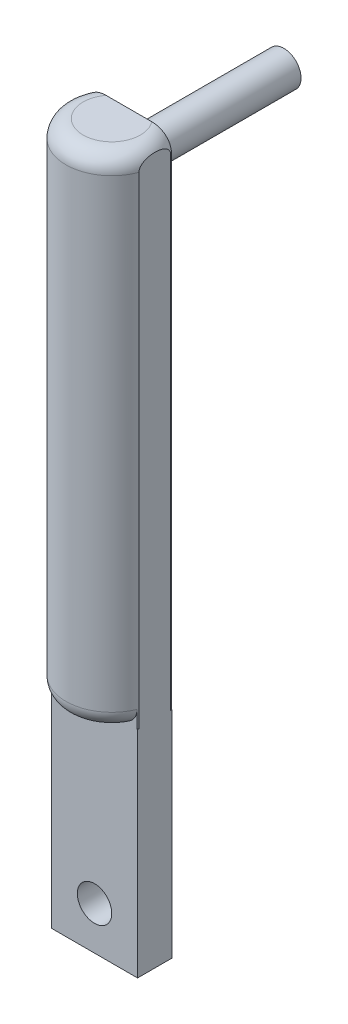
ISO-10303-21;
HEADER;
FILE_DESCRIPTION(('STEP AP214'),'2;1');
FILE_NAME('part.step','',(''),(''),'','','');
FILE_SCHEMA(('AUTOMOTIVE_DESIGN { 1 0 10303 214 1 1 1 1 }'));
ENDSEC;
DATA;
#1=APPLICATION_CONTEXT('core data for automotive mechanical design processes');
#2=APPLICATION_PROTOCOL_DEFINITION('international standard','automotive_design',2000,#1);
#3=PRODUCT_CONTEXT('',#1,'mechanical');
#4=PRODUCT('Part','Part','',(#3));
#5=PRODUCT_RELATED_PRODUCT_CATEGORY('part','',(#4));
#6=PRODUCT_DEFINITION_FORMATION('','',#4);
#7=PRODUCT_DEFINITION_CONTEXT('part definition',#1,'design');
#8=PRODUCT_DEFINITION('design','',#6,#7);
#9=PRODUCT_DEFINITION_SHAPE('','',#8);
#10=(LENGTH_UNIT() NAMED_UNIT(*) SI_UNIT(.MILLI.,.METRE.));
#11=(NAMED_UNIT(*) PLANE_ANGLE_UNIT() SI_UNIT($,.RADIAN.));
#12=(NAMED_UNIT(*) SI_UNIT($,.STERADIAN.) SOLID_ANGLE_UNIT());
#13=UNCERTAINTY_MEASURE_WITH_UNIT(LENGTH_MEASURE(1.E-05),#10,'distance_accuracy_value','');
#14=(GEOMETRIC_REPRESENTATION_CONTEXT(3) GLOBAL_UNCERTAINTY_ASSIGNED_CONTEXT((#13)) GLOBAL_UNIT_ASSIGNED_CONTEXT((#10,
#11,#12)) REPRESENTATION_CONTEXT('',''));
#15=CARTESIAN_POINT('',(0.,0.,0.));
#16=DIRECTION('',(0.,0.,1.));
#17=DIRECTION('',(1.,0.,0.));
#18=AXIS2_PLACEMENT_3D('',#15,#16,#17);
#19=CARTESIAN_POINT('',(-25.,37.5000000000001,20.));
#20=DIRECTION('',(0.,-1.,0.));
#21=DIRECTION('',(0.,0.,-1.));
#22=AXIS2_PLACEMENT_3D('',#19,#20,#21);
#23=PLANE('',#22);
#24=CARTESIAN_POINT('',(0.,37.5000000000001,10.));
#25=DIRECTION('',(0.,1.,0.));
#26=DIRECTION('',(0.,0.,1.));
#27=AXIS2_PLACEMENT_3D('',#24,#25,#26);
#28=CIRCLE('',#27,26.6340417534553);
#29=CARTESIAN_POINT('',(-25.,37.5000000000001,19.1854330395904));
#30=VERTEX_POINT('',#29);
#31=CARTESIAN_POINT('',(-24.6854649566258,37.5000000000001,20.));
#32=VERTEX_POINT('',#31);
#33=EDGE_CURVE('E167',#30,#32,#28,.T.);
#34=ORIENTED_EDGE('',*,*,#33,.F.);
#35=DIRECTION('',(0.,0.,-1.));
#36=VECTOR('',#35,1.);
#37=CARTESIAN_POINT('',(-25.,37.5000000000001,20.));
#38=LINE('',#37,#36);
#39=CARTESIAN_POINT('',(-25.,37.5000000000001,20.));
#40=VERTEX_POINT('',#39);
#41=EDGE_CURVE('E210',#40,#30,#38,.T.);
#42=ORIENTED_EDGE('',*,*,#41,.F.);
#43=DIRECTION('',(-1.,0.,0.));
#44=VECTOR('',#43,1.);
#45=CARTESIAN_POINT('',(-25.,37.5000000000001,20.));
#46=LINE('',#45,#44);
#47=EDGE_CURVE('E198',#32,#40,#46,.T.);
#48=ORIENTED_EDGE('',*,*,#47,.F.);
#49=EDGE_LOOP('',(#34,#42,#48));
#50=FACE_BOUND('',#49,.T.);
#51=ADVANCED_FACE('F34',(#50),#23,.F.);
#52=CARTESIAN_POINT('',(24.6854649566258,37.5000000000001,20.));
#53=VERTEX_POINT('',#52);
#54=CARTESIAN_POINT('',(25.,37.5000000000001,19.1854330395904));
#55=VERTEX_POINT('',#54);
#56=EDGE_CURVE('E174',#53,#55,#28,.T.);
#57=ORIENTED_EDGE('',*,*,#56,.F.);
#58=CARTESIAN_POINT('',(25.,37.5000000000001,20.));
#59=VERTEX_POINT('',#58);
#60=EDGE_CURVE('E199',#59,#53,#46,.T.);
#61=ORIENTED_EDGE('',*,*,#60,.F.);
#62=DIRECTION('',(0.,0.,-1.));
#63=VECTOR('',#62,1.);
#64=CARTESIAN_POINT('',(25.,37.5000000000001,20.));
#65=LINE('',#64,#63);
#66=EDGE_CURVE('E213',#59,#55,#65,.T.);
#67=ORIENTED_EDGE('',*,*,#66,.T.);
#68=EDGE_LOOP('',(#57,#61,#67));
#69=FACE_BOUND('',#68,.T.);
#70=ADVANCED_FACE('F328',(#69),#23,.F.);
#71=CARTESIAN_POINT('',(0.,37.5000000000001,10.));
#72=DIRECTION('',(0.,1.,0.));
#73=DIRECTION('',(0.,0.,1.));
#74=AXIS2_PLACEMENT_3D('',#71,#72,#73);
#75=CIRCLE('',#74,26.6340417534553);
#76=CARTESIAN_POINT('',(-24.6854649566258,37.5000000000001,0.));
#77=VERTEX_POINT('',#76);
#78=CARTESIAN_POINT('',(-25.,37.5000000000001,0.814566960409597));
#79=VERTEX_POINT('',#78);
#80=EDGE_CURVE('E166',#77,#79,#75,.T.);
#81=ORIENTED_EDGE('',*,*,#80,.F.);
#82=DIRECTION('',(-1.,0.,0.));
#83=VECTOR('',#82,1.);
#84=CARTESIAN_POINT('',(-25.,37.5000000000001,0.));
#85=LINE('',#84,#83);
#86=CARTESIAN_POINT('',(-25.,37.5000000000001,0.));
#87=VERTEX_POINT('',#86);
#88=EDGE_CURVE('E162',#77,#87,#85,.T.);
#89=ORIENTED_EDGE('',*,*,#88,.T.);
#90=EDGE_CURVE('E202',#79,#87,#38,.T.);
#91=ORIENTED_EDGE('',*,*,#90,.F.);
#92=EDGE_LOOP('',(#81,#89,#91));
#93=FACE_BOUND('',#92,.T.);
#94=ADVANCED_FACE('F258',(#93),#23,.F.);
#95=CARTESIAN_POINT('',(0.,0.,20.));
#96=DIRECTION('',(0.,0.,-1.));
#97=DIRECTION('',(-1.,0.,0.));
#98=AXIS2_PLACEMENT_3D('',#95,#96,#97);
#99=PLANE('',#98);
#100=DIRECTION('',(0.,-1.,0.));
#101=VECTOR('',#100,1.);
#102=CARTESIAN_POINT('',(-25.,-87.4999999999999,20.));
#103=LINE('',#102,#101);
#104=CARTESIAN_POINT('',(-25.,-87.4999999999999,20.));
#105=VERTEX_POINT('',#104);
#106=EDGE_CURVE('E161',#40,#105,#103,.T.);
#107=ORIENTED_EDGE('',*,*,#106,.T.);
#108=DIRECTION('',(1.,0.,0.));
#109=VECTOR('',#108,1.);
#110=CARTESIAN_POINT('',(-25.,-87.4999999999999,20.));
#111=LINE('',#110,#109);
#112=CARTESIAN_POINT('',(25.,-87.4999999999999,20.));
#113=VERTEX_POINT('',#112);
#114=EDGE_CURVE('E194',#105,#113,#111,.T.);
#115=ORIENTED_EDGE('',*,*,#114,.T.);
#116=DIRECTION('',(0.,1.,0.));
#117=VECTOR('',#116,1.);
#118=CARTESIAN_POINT('',(25.,-87.4999999999999,20.));
#119=LINE('',#118,#117);
#120=EDGE_CURVE('E196',#113,#59,#119,.T.);
#121=ORIENTED_EDGE('',*,*,#120,.T.);
#122=ORIENTED_EDGE('',*,*,#60,.T.);
#123=DIRECTION('',(0.,-1.,0.));
#124=VECTOR('',#123,1.);
#125=CARTESIAN_POINT('',(24.6854649566258,47.5000000000001,20.));
#126=LINE('',#125,#124);
#127=CARTESIAN_POINT('',(24.6854649566258,47.5000000000001,20.));
#128=VERTEX_POINT('',#127);
#129=EDGE_CURVE('E228',#128,#53,#126,.T.);
#130=ORIENTED_EDGE('',*,*,#129,.F.);
#131=CARTESIAN_POINT('',(24.6854649566258,47.5000000000001,20.));
#132=CARTESIAN_POINT('',(24.685502333544,47.2354048706731,20.));
#133=CARTESIAN_POINT('',(24.6741360931719,46.9708185569598,20.));
#134=CARTESIAN_POINT('',(24.6288688417906,46.4436173996782,20.));
#135=CARTESIAN_POINT('',(24.594971058111,46.1810022792113,20.));
#136=CARTESIAN_POINT('',(24.5050151062512,45.6602113688034,20.));
#137=CARTESIAN_POINT('',(24.4490073426315,45.4020268656095,20.));
#138=CARTESIAN_POINT('',(24.315351716817,44.8913238318034,20.));
#139=CARTESIAN_POINT('',(24.2377037496296,44.6388053286875,20.));
#140=CARTESIAN_POINT('',(24.0614658574471,44.1411991247243,20.));
#141=CARTESIAN_POINT('',(23.9628765841889,43.8961111928933,20.));
#142=CARTESIAN_POINT('',(23.7456242090275,43.4149980034634,20.));
#143=CARTESIAN_POINT('',(23.6269605105004,43.1789730154763,20.));
#144=CARTESIAN_POINT('',(23.3705575400671,42.7174563795879,20.));
#145=CARTESIAN_POINT('',(23.2328137271902,42.491967256304,20.));
#146=CARTESIAN_POINT('',(22.93943448027,42.0529531322834,20.));
#147=CARTESIAN_POINT('',(22.78379884132,41.8394282686093,20.));
#148=CARTESIAN_POINT('',(22.4524221709919,41.4211516686134,20.));
#149=CARTESIAN_POINT('',(22.2763240688215,41.2166829271807,20.));
#150=CARTESIAN_POINT('',(21.9082477159469,40.8225904806807,20.));
#151=CARTESIAN_POINT('',(21.7162692972657,40.6329669326824,20.));
#152=CARTESIAN_POINT('',(21.3180119435982,40.2695272458504,20.));
#153=CARTESIAN_POINT('',(21.1117373682874,40.0957063249914,20.));
#154=CARTESIAN_POINT('',(20.6863790104067,39.7645016280252,20.));
#155=CARTESIAN_POINT('',(20.4672940734397,39.6071193368457,20.));
#156=CARTESIAN_POINT('',(20.0034251911003,39.2997265635389,20.));
#157=CARTESIAN_POINT('',(19.7578947606835,39.1508425232746,20.));
#158=CARTESIAN_POINT('',(19.2559864632393,38.8726600926899,20.));
#159=CARTESIAN_POINT('',(18.9996079978619,38.7433627845299,20.));
#160=CARTESIAN_POINT('',(18.4774106008518,38.5042941110642,20.));
#161=CARTESIAN_POINT('',(18.211576860291,38.3945551534595,20.));
#162=CARTESIAN_POINT('',(17.6726102042045,38.1947596307076,20.));
#163=CARTESIAN_POINT('',(17.3994765765544,38.1047049937438,20.));
#164=CARTESIAN_POINT('',(16.8124858804315,37.9337631201385,20.));
#165=CARTESIAN_POINT('',(16.4978653875977,37.8554960767532,20.));
#166=CARTESIAN_POINT('',(15.8635570107187,37.7228356020987,20.));
#167=CARTESIAN_POINT('',(15.5438674321648,37.6684503361797,20.));
#168=CARTESIAN_POINT('',(14.9027615165873,37.5827496947825,20.));
#169=CARTESIAN_POINT('',(14.5813572580198,37.5513426122924,20.));
#170=CARTESIAN_POINT('',(13.9374432749619,37.5099575658924,20.));
#171=CARTESIAN_POINT('',(13.6149347858157,37.499960594515,20.));
#172=CARTESIAN_POINT('',(13.2925296710481,37.5000000000001,20.));
#173=B_SPLINE_CURVE_WITH_KNOTS('',3,(#131,#132,#133,#134,#135,#136,#137,#138,#139,#140,#141,
#142,#143,#144,#145,#146,#147,#148,#149,#150,#151,#152,#153,#154,#155,#156,#157,#158,#159,#160,
#161,#162,#163,#164,#165,#166,#167,#168,#169,#170,#171,#172),.UNSPECIFIED.,.F.,.F.,(4,2,2,2,2,2,
2,2,2,2,2,2,2,2,2,2,2,2,2,2,4),(0.,0.793528086377154,1.58694253540087,2.37855857135951,
3.17017844810043,3.96177369160078,4.75339246591003,5.54519996621658,6.33701653562515,
7.14566568868088,7.95432339646171,8.76273557648567,9.57122071863946,10.4317423579137,
11.292311523393,12.1542936354331,13.01636014539,13.9880016854706,14.9599751785634,
15.9280479972663,16.8952610234548),.UNSPECIFIED.);
#174=CARTESIAN_POINT('',(13.2925296710481,37.5000000000001,20.));
#175=VERTEX_POINT('',#174);
#176=EDGE_CURVE('E47',#128,#175,#173,.T.);
#177=ORIENTED_EDGE('',*,*,#176,.T.);
#178=CARTESIAN_POINT('',(-13.2925296710481,37.5000000000001,20.));
#179=VERTEX_POINT('',#178);
#180=EDGE_CURVE('E203',#175,#179,#46,.T.);
#181=ORIENTED_EDGE('',*,*,#180,.T.);
#182=CARTESIAN_POINT('',(-13.2925296710481,37.5000000000001,20.));
#183=CARTESIAN_POINT('',(-13.4678988208894,37.499998957693,20.));
#184=CARTESIAN_POINT('',(-13.6432588060788,37.5029466001775,20.));
#185=CARTESIAN_POINT('',(-13.9937855734076,37.514976364156,20.));
#186=CARTESIAN_POINT('',(-14.1689523329059,37.5240591409631,20.));
#187=CARTESIAN_POINT('',(-14.6941682591193,37.5608877316065,20.));
#188=CARTESIAN_POINT('',(-15.0436074790335,37.5982146960043,20.));
#189=CARTESIAN_POINT('',(-15.7401842543162,37.7002231729067,20.));
#190=CARTESIAN_POINT('',(-16.0873028901114,37.765034268809,20.));
#191=CARTESIAN_POINT('',(-16.7748721321702,37.923245288306,20.));
#192=CARTESIAN_POINT('',(-17.1153255857604,38.0166327076168,20.));
#193=CARTESIAN_POINT('',(-17.7468338880676,38.2199612468514,20.));
#194=CARTESIAN_POINT('',(-18.0389487657435,38.3266133990957,20.));
#195=CARTESIAN_POINT('',(-18.61366671236,38.5630132510472,20.));
#196=CARTESIAN_POINT('',(-18.8962711760362,38.6927575465046,20.));
#197=CARTESIAN_POINT('',(-19.4492108574748,38.9750647195608,20.));
#198=CARTESIAN_POINT('',(-19.7195677548349,39.1275850451958,20.));
#199=CARTESIAN_POINT('',(-20.2462128978425,39.4552725251177,20.));
#200=CARTESIAN_POINT('',(-20.502501350165,39.630439346585,20.));
#201=CARTESIAN_POINT('',(-21.0000191501439,40.0037882696041,20.));
#202=CARTESIAN_POINT('',(-21.2411556287769,40.2020943512131,20.));
#203=CARTESIAN_POINT('',(-21.704373805633,40.619880966814,20.));
#204=CARTESIAN_POINT('',(-21.926454855438,40.8393622208151,20.));
#205=CARTESIAN_POINT('',(-22.3492988941623,41.298193873444,20.));
#206=CARTESIAN_POINT('',(-22.5500517657368,41.5375536066573,20.));
#207=CARTESIAN_POINT('',(-22.9278708728071,42.0342767668804,20.));
#208=CARTESIAN_POINT('',(-23.1049399778125,42.2916380070748,20.));
#209=CARTESIAN_POINT('',(-23.4182572389001,42.7978674017579,20.));
#210=CARTESIAN_POINT('',(-23.5567615499112,43.0453417177048,20.));
#211=CARTESIAN_POINT('',(-23.8112062967775,43.5516225251864,20.));
#212=CARTESIAN_POINT('',(-23.9271485367665,43.8104281086085,20.));
#213=CARTESIAN_POINT('',(-24.1351791579827,44.3371000150378,20.));
#214=CARTESIAN_POINT('',(-24.2272964635335,44.6049549007166,20.));
#215=CARTESIAN_POINT('',(-24.3868869205741,45.1477878229566,20.));
#216=CARTESIAN_POINT('',(-24.4543691380709,45.4227631991146,20.));
#217=CARTESIAN_POINT('',(-24.567758903721,45.9966224895792,20.));
#218=CARTESIAN_POINT('',(-24.6118914497627,46.2958624980114,20.));
#219=CARTESIAN_POINT('',(-24.6560274209174,46.7465694439571,20.));
#220=CARTESIAN_POINT('',(-24.6670622560725,46.897033466352,20.));
#221=CARTESIAN_POINT('',(-24.6817811689466,47.1983230811585,20.));
#222=CARTESIAN_POINT('',(-24.6854651259334,47.3491486794679,20.));
#223=CARTESIAN_POINT('',(-24.6854649566258,47.5000000000001,20.));
#224=B_SPLINE_CURVE_WITH_KNOTS('',3,(#182,#183,#184,#185,#186,#187,#188,#189,#190,#191,#192,
#193,#194,#195,#196,#197,#198,#199,#200,#201,#202,#203,#204,#205,#206,#207,#208,#209,#210,#211,
#212,#213,#214,#215,#216,#217,#218,#219,#220,#221,#222,#223),.UNSPECIFIED.,.F.,.F.,(4,2,2,2,2,2,
2,2,2,2,2,2,2,2,2,2,2,2,2,2,4),(0.,0.526059487486561,1.05217517393821,2.10538108713694,
3.16360890057145,4.22137432056793,5.15335792112525,6.08520424204954,7.0153309054618,
7.94544390101876,8.88079150012673,9.8161709146338,10.7519920778019,11.6876997545846,
12.5373970816054,13.387026436221,14.2356194166075,15.0838997890608,15.9897497342592,
16.442200055629,16.8946578080581),.UNSPECIFIED.);
#225=CARTESIAN_POINT('',(-24.6854649566258,47.5000000000001,20.));
#226=VERTEX_POINT('',#225);
#227=EDGE_CURVE('E11',#179,#226,#224,.T.);
#228=ORIENTED_EDGE('',*,*,#227,.T.);
#229=DIRECTION('',(0.,-1.,0.));
#230=VECTOR('',#229,1.);
#231=CARTESIAN_POINT('',(-24.6854649566258,37.5000000000001,20.));
#232=LINE('',#231,#230);
#233=EDGE_CURVE('E53',#32,#226,#232,.F.);
#234=ORIENTED_EDGE('',*,*,#233,.F.);
#235=ORIENTED_EDGE('',*,*,#47,.T.);
#236=EDGE_LOOP('',(#107,#115,#121,#122,#130,#177,#181,#228,#234,#235));
#237=FACE_BOUND('',#236,.T.);
#238=CARTESIAN_POINT('',(0.,-62.5,20.));
#239=DIRECTION('',(0.,0.,1.));
#240=DIRECTION('',(1.,0.,0.));
#241=AXIS2_PLACEMENT_3D('',#238,#239,#240);
#242=CIRCLE('',#241,10.);
#243=CARTESIAN_POINT('',(10.,-62.5,20.));
#244=VERTEX_POINT('',#243);
#245=EDGE_CURVE('E186',#244,#244,#242,.T.);
#246=ORIENTED_EDGE('',*,*,#245,.F.);
#247=EDGE_LOOP('',(#246));
#248=FACE_BOUND('',#247,.T.);
#249=ADVANCED_FACE('F249',(#237,#248),#99,.F.);
#250=CARTESIAN_POINT('',(0.,0.,0.));
#251=DIRECTION('',(0.,0.,-1.));
#252=DIRECTION('',(-1.,0.,0.));
#253=AXIS2_PLACEMENT_3D('',#250,#251,#252);
#254=PLANE('',#253);
#255=CARTESIAN_POINT('',(0.,302.814535043374,0.));
#256=DIRECTION('',(0.,0.,-1.));
#257=DIRECTION('',(-1.,0.,0.));
#258=AXIS2_PLACEMENT_3D('',#255,#256,#257);
#259=CIRCLE('',#258,10.);
#260=CARTESIAN_POINT('',(9.99999999999998,302.814535043374,0.));
#261=VERTEX_POINT('',#260);
#262=EDGE_CURVE('E306',#261,#261,#259,.T.);
#263=ORIENTED_EDGE('',*,*,#262,.F.);
#264=EDGE_LOOP('',(#263));
#265=FACE_BOUND('',#264,.T.);
#266=DIRECTION('',(-1.,0.,0.));
#267=VECTOR('',#266,1.);
#268=CARTESIAN_POINT('',(0.,327.5,0.));
#269=LINE('',#268,#267);
#270=CARTESIAN_POINT('',(13.2925296710481,327.5,0.));
#271=VERTEX_POINT('',#270);
#272=CARTESIAN_POINT('',(-13.2925296710481,327.5,0.));
#273=VERTEX_POINT('',#272);
#274=EDGE_CURVE('E170',#271,#273,#269,.T.);
#275=ORIENTED_EDGE('',*,*,#274,.F.);
#276=CARTESIAN_POINT('',(13.2925296710481,327.5,0.));
#277=CARTESIAN_POINT('',(13.4678988208894,327.500001042307,0.));
#278=CARTESIAN_POINT('',(13.6432588060788,327.497053399823,0.));
#279=CARTESIAN_POINT('',(13.9937855734076,327.485023635844,0.));
#280=CARTESIAN_POINT('',(14.1689523329059,327.475940859037,0.));
#281=CARTESIAN_POINT('',(14.6941682591193,327.439112268394,0.));
#282=CARTESIAN_POINT('',(15.0436074790335,327.401785303996,0.));
#283=CARTESIAN_POINT('',(15.7401842543162,327.299776827093,0.));
#284=CARTESIAN_POINT('',(16.0873028901114,327.234965731191,0.));
#285=CARTESIAN_POINT('',(16.7748721321702,327.076754711694,0.));
#286=CARTESIAN_POINT('',(17.1153255857604,326.983367292383,0.));
#287=CARTESIAN_POINT('',(17.7468338880676,326.780038753149,0.));
#288=CARTESIAN_POINT('',(18.0389487657435,326.673386600904,0.));
#289=CARTESIAN_POINT('',(18.61366671236,326.436986748953,0.));
#290=CARTESIAN_POINT('',(18.8962711760362,326.307242453496,0.));
#291=CARTESIAN_POINT('',(19.4492108574748,326.024935280439,0.));
#292=CARTESIAN_POINT('',(19.7195677548349,325.872414954804,0.));
#293=CARTESIAN_POINT('',(20.2462128978425,325.544727474883,0.));
#294=CARTESIAN_POINT('',(20.502501350165,325.369560653415,0.));
#295=CARTESIAN_POINT('',(21.0000191501439,324.996211730396,0.));
#296=CARTESIAN_POINT('',(21.2411556287769,324.797905648787,0.));
#297=CARTESIAN_POINT('',(21.704373805633,324.380119033186,0.));
#298=CARTESIAN_POINT('',(21.9264548554379,324.160637779185,0.));
#299=CARTESIAN_POINT('',(22.3492988941623,323.701806126556,0.));
#300=CARTESIAN_POINT('',(22.5500517657369,323.462446393343,0.));
#301=CARTESIAN_POINT('',(22.9278708728071,322.96572323312,0.));
#302=CARTESIAN_POINT('',(23.1049399778125,322.708361992925,0.));
#303=CARTESIAN_POINT('',(23.4182572389001,322.202132598242,0.));
#304=CARTESIAN_POINT('',(23.5567615499112,321.954658282295,0.));
#305=CARTESIAN_POINT('',(23.8112062967775,321.448377474814,0.));
#306=CARTESIAN_POINT('',(23.9271485367665,321.189571891392,0.));
#307=CARTESIAN_POINT('',(24.1351791579827,320.662899984962,0.));
#308=CARTESIAN_POINT('',(24.2272964635336,320.395045099283,0.));
#309=CARTESIAN_POINT('',(24.3868869205741,319.852212177043,0.));
#310=CARTESIAN_POINT('',(24.4543691380709,319.577236800885,0.));
#311=CARTESIAN_POINT('',(24.567758903721,319.003377510421,0.));
#312=CARTESIAN_POINT('',(24.6118914497628,318.704137501989,0.));
#313=CARTESIAN_POINT('',(24.6560274209174,318.253430556043,0.));
#314=CARTESIAN_POINT('',(24.6670622560725,318.102966533648,0.));
#315=CARTESIAN_POINT('',(24.6817811689466,317.801676918842,0.));
#316=CARTESIAN_POINT('',(24.6854651259334,317.650851320532,0.));
#317=CARTESIAN_POINT('',(24.6854649566258,317.5,0.));
#318=B_SPLINE_CURVE_WITH_KNOTS('',3,(#276,#277,#278,#279,#280,#281,#282,#283,#284,#285,#286,
#287,#288,#289,#290,#291,#292,#293,#294,#295,#296,#297,#298,#299,#300,#301,#302,#303,#304,#305,
#306,#307,#308,#309,#310,#311,#312,#313,#314,#315,#316,#317),.UNSPECIFIED.,.F.,.F.,(4,2,2,2,2,2,
2,2,2,2,2,2,2,2,2,2,2,2,2,2,4),(0.,0.526059487486561,1.05217517393821,2.10538108713695,
3.16360890057146,4.22137432056793,5.15335792112522,6.08520424204955,7.0153309054618,
7.94544390101876,8.88079150012675,9.81617091463378,10.7519920778019,11.6876997545847,
12.5373970816054,13.387026436221,14.2356194166076,15.0838997890609,15.9897497342593,
16.4422000556289,16.8946578080581),.UNSPECIFIED.);
#319=CARTESIAN_POINT('',(24.6854649566258,317.5,0.));
#320=VERTEX_POINT('',#319);
#321=EDGE_CURVE('E147',#271,#320,#318,.T.);
#322=ORIENTED_EDGE('',*,*,#321,.T.);
#323=DIRECTION('',(0.,-1.,0.));
#324=VECTOR('',#323,1.);
#325=CARTESIAN_POINT('',(24.6854649566258,327.5,0.));
#326=LINE('',#325,#324);
#327=CARTESIAN_POINT('',(24.6854649566258,37.5000000000001,0.));
#328=VERTEX_POINT('',#327);
#329=EDGE_CURVE('E140',#320,#328,#326,.T.);
#330=ORIENTED_EDGE('',*,*,#329,.T.);
#331=CARTESIAN_POINT('',(25.,37.5000000000001,0.));
#332=VERTEX_POINT('',#331);
#333=EDGE_CURVE('E146',#332,#328,#85,.T.);
#334=ORIENTED_EDGE('',*,*,#333,.F.);
#335=DIRECTION('',(0.,1.,0.));
#336=VECTOR('',#335,1.);
#337=CARTESIAN_POINT('',(25.,-87.4999999999999,0.));
#338=LINE('',#337,#336);
#339=CARTESIAN_POINT('',(25.,-87.4999999999999,0.));
#340=VERTEX_POINT('',#339);
#341=EDGE_CURVE('E208',#340,#332,#338,.T.);
#342=ORIENTED_EDGE('',*,*,#341,.F.);
#343=DIRECTION('',(1.,0.,0.));
#344=VECTOR('',#343,1.);
#345=CARTESIAN_POINT('',(-25.,-87.4999999999999,0.));
#346=LINE('',#345,#344);
#347=CARTESIAN_POINT('',(-25.,-87.4999999999999,0.));
#348=VERTEX_POINT('',#347);
#349=EDGE_CURVE('E206',#348,#340,#346,.T.);
#350=ORIENTED_EDGE('',*,*,#349,.F.);
#351=DIRECTION('',(0.,-1.,0.));
#352=VECTOR('',#351,1.);
#353=CARTESIAN_POINT('',(-25.,-87.4999999999999,0.));
#354=LINE('',#353,#352);
#355=EDGE_CURVE('E189',#87,#348,#354,.T.);
#356=ORIENTED_EDGE('',*,*,#355,.F.);
#357=ORIENTED_EDGE('',*,*,#88,.F.);
#358=DIRECTION('',(0.,-1.,0.));
#359=VECTOR('',#358,1.);
#360=CARTESIAN_POINT('',(-24.6854649566258,327.5,0.));
#361=LINE('',#360,#359);
#362=CARTESIAN_POINT('',(-24.6854649566258,317.5,0.));
#363=VERTEX_POINT('',#362);
#364=EDGE_CURVE('E152',#363,#77,#361,.T.);
#365=ORIENTED_EDGE('',*,*,#364,.F.);
#366=CARTESIAN_POINT('',(-24.6854649566258,317.5,0.));
#367=CARTESIAN_POINT('',(-24.685502333544,317.764595129327,0.));
#368=CARTESIAN_POINT('',(-24.6741360931719,318.02918144304,0.));
#369=CARTESIAN_POINT('',(-24.6288688417906,318.556382600322,0.));
#370=CARTESIAN_POINT('',(-24.594971058111,318.818997720789,0.));
#371=CARTESIAN_POINT('',(-24.5050151062512,319.339788631197,0.));
#372=CARTESIAN_POINT('',(-24.4490073426316,319.597973134391,0.));
#373=CARTESIAN_POINT('',(-24.3153517168171,320.108676168197,0.));
#374=CARTESIAN_POINT('',(-24.2377037496296,320.361194671313,0.));
#375=CARTESIAN_POINT('',(-24.0614658574471,320.858800875276,0.));
#376=CARTESIAN_POINT('',(-23.9628765841889,321.103888807107,0.));
#377=CARTESIAN_POINT('',(-23.7456242090275,321.585001996537,0.));
#378=CARTESIAN_POINT('',(-23.6269605105004,321.821026984524,0.));
#379=CARTESIAN_POINT('',(-23.3705575400671,322.282543620412,0.));
#380=CARTESIAN_POINT('',(-23.2328137271902,322.508032743696,0.));
#381=CARTESIAN_POINT('',(-22.93943448027,322.947046867717,0.));
#382=CARTESIAN_POINT('',(-22.7837988413199,323.160571731391,0.));
#383=CARTESIAN_POINT('',(-22.4524221709919,323.578848331387,0.));
#384=CARTESIAN_POINT('',(-22.2763240688215,323.783317072819,0.));
#385=CARTESIAN_POINT('',(-21.9082477159469,324.177409519319,0.));
#386=CARTESIAN_POINT('',(-21.7162692972657,324.367033067318,0.));
#387=CARTESIAN_POINT('',(-21.3180119435981,324.73047275415,0.));
#388=CARTESIAN_POINT('',(-21.1117373682874,324.904293675009,0.));
#389=CARTESIAN_POINT('',(-20.6863790104067,325.235498371975,0.));
#390=CARTESIAN_POINT('',(-20.4672940734396,325.392880663154,0.));
#391=CARTESIAN_POINT('',(-20.0034251911002,325.700273436461,0.));
#392=CARTESIAN_POINT('',(-19.7578947606835,325.849157476726,0.));
#393=CARTESIAN_POINT('',(-19.2559864632393,326.12733990731,0.));
#394=CARTESIAN_POINT('',(-18.9996079978619,326.25663721547,0.));
#395=CARTESIAN_POINT('',(-18.4774106008518,326.495705888936,0.));
#396=CARTESIAN_POINT('',(-18.211576860291,326.605444846541,0.));
#397=CARTESIAN_POINT('',(-17.6726102042044,326.805240369293,0.));
#398=CARTESIAN_POINT('',(-17.3994765765544,326.895295006256,0.));
#399=CARTESIAN_POINT('',(-16.8124858804315,327.066236879862,0.));
#400=CARTESIAN_POINT('',(-16.4978653875977,327.144503923247,0.));
#401=CARTESIAN_POINT('',(-15.8635570107186,327.277164397901,0.));
#402=CARTESIAN_POINT('',(-15.5438674321648,327.33154966382,0.));
#403=CARTESIAN_POINT('',(-14.9027615165873,327.417250305218,0.));
#404=CARTESIAN_POINT('',(-14.5813572580198,327.448657387708,0.));
#405=CARTESIAN_POINT('',(-13.9374432749618,327.490042434108,0.));
#406=CARTESIAN_POINT('',(-13.6149347858157,327.500039405485,0.));
#407=CARTESIAN_POINT('',(-13.2925296710481,327.5,0.));
#408=B_SPLINE_CURVE_WITH_KNOTS('',3,(#366,#367,#368,#369,#370,#371,#372,#373,#374,#375,#376,
#377,#378,#379,#380,#381,#382,#383,#384,#385,#386,#387,#388,#389,#390,#391,#392,#393,#394,#395,
#396,#397,#398,#399,#400,#401,#402,#403,#404,#405,#406,#407),.UNSPECIFIED.,.F.,.F.,(4,2,2,2,2,2,
2,2,2,2,2,2,2,2,2,2,2,2,2,2,4),(0.,0.793528086377189,1.58694253540085,2.37855857135948,
3.17017844810043,3.9617736916008,4.75339246591005,5.54519996621661,6.33701653562517,
7.14566568868092,7.95432339646174,8.76273557648573,9.57122071863947,10.4317423579137,
11.2923115233931,12.1542936354332,13.01636014539,13.9880016854706,14.9599751785635,
15.9280479972663,16.8952610234548),.UNSPECIFIED.);
#409=EDGE_CURVE('E235',#363,#273,#408,.T.);
#410=ORIENTED_EDGE('',*,*,#409,.T.);
#411=EDGE_LOOP('',(#275,#322,#330,#334,#342,#350,#356,#357,#365,#410));
#412=FACE_BOUND('',#411,.T.);
#413=CARTESIAN_POINT('',(0.,-62.5,0.));
#414=DIRECTION('',(0.,0.,1.));
#415=DIRECTION('',(1.,0.,0.));
#416=AXIS2_PLACEMENT_3D('',#413,#414,#415);
#417=CIRCLE('',#416,10.);
#418=CARTESIAN_POINT('',(10.,-62.5,0.));
#419=VERTEX_POINT('',#418);
#420=EDGE_CURVE('E185',#419,#419,#417,.T.);
#421=ORIENTED_EDGE('',*,*,#420,.T.);
#422=EDGE_LOOP('',(#421));
#423=FACE_BOUND('',#422,.T.);
#424=ADVANCED_FACE('F143',(#265,#412,#423),#254,.T.);
#425=CARTESIAN_POINT('',(-25.,-87.4999999999999,20.));
#426=DIRECTION('',(1.,0.,0.));
#427=DIRECTION('',(0.,0.,-1.));
#428=AXIS2_PLACEMENT_3D('',#425,#426,#427);
#429=PLANE('',#428);
#430=DIRECTION('',(0.,-1.,0.));
#431=VECTOR('',#430,1.);
#432=CARTESIAN_POINT('',(-25.,327.5,19.1854330395904));
#433=LINE('',#432,#431);
#434=CARTESIAN_POINT('',(-25.,317.5,19.1854330395904));
#435=VERTEX_POINT('',#434);
#436=EDGE_CURVE('E177',#435,#30,#433,.T.);
#437=ORIENTED_EDGE('',*,*,#436,.F.);
#438=CARTESIAN_POINT('',(-25.,317.5,19.1854330395904));
#439=CARTESIAN_POINT('',(-25.,317.604031786222,19.1854666951989));
#440=CARTESIAN_POINT('',(-25.,317.708045694795,19.1807269973601));
#441=CARTESIAN_POINT('',(-25.,317.915160799453,19.1619591256552));
#442=CARTESIAN_POINT('',(-25.,318.018262587497,19.1479375048867));
#443=CARTESIAN_POINT('',(-25.,318.222022122098,19.1110089521886));
#444=CARTESIAN_POINT('',(-25.,318.322692704751,19.0881726755161));
#445=CARTESIAN_POINT('',(-25.,318.521729244324,19.0340794857688));
#446=CARTESIAN_POINT('',(-25.,318.620094895677,19.0028214630056));
#447=CARTESIAN_POINT('',(-25.,318.910312477992,18.8974050116726));
#448=CARTESIAN_POINT('',(-25.,319.097993151133,18.8114702638095));
#449=CARTESIAN_POINT('',(-25.,319.45901691984,18.6132641309951));
#450=CARTESIAN_POINT('',(-25.,319.632329186126,18.5009380023748));
#451=CARTESIAN_POINT('',(-25.,320.051047829676,18.1898074073288));
#452=CARTESIAN_POINT('',(-25.,320.285874538765,17.9767528728676));
#453=CARTESIAN_POINT('',(-25.,320.718990415879,17.5162874675845));
#454=CARTESIAN_POINT('',(-25.,320.917191615364,17.268796319735));
#455=CARTESIAN_POINT('',(-25.,321.239750573895,16.8079557822696));
#456=CARTESIAN_POINT('',(-25.,321.370746140719,16.5991555953374));
#457=CARTESIAN_POINT('',(-25.,321.614129114558,16.170885300247));
#458=CARTESIAN_POINT('',(-25.,321.726505963097,15.9514092285417));
#459=CARTESIAN_POINT('',(-25.,321.934329482543,15.5043550250329));
#460=CARTESIAN_POINT('',(-25.,322.029757117567,15.2767681238606));
#461=CARTESIAN_POINT('',(-25.,322.205026089465,14.8156412196847));
#462=CARTESIAN_POINT('',(-25.,322.284862201348,14.5820992505748));
#463=CARTESIAN_POINT('',(-25.,322.474963204576,13.9653772183932));
#464=CARTESIAN_POINT('',(-25.,322.573688218849,13.5786180823795));
#465=CARTESIAN_POINT('',(-25.,322.737806311967,12.79802636433));
#466=CARTESIAN_POINT('',(-25.,322.803178377431,12.4041894844346));
#467=CARTESIAN_POINT('',(-25.,322.903344989268,11.6114200595047));
#468=CARTESIAN_POINT('',(-25.,322.938042223146,11.2124753419432));
#469=CARTESIAN_POINT('',(-25.,322.977912461758,10.4132462567807));
#470=CARTESIAN_POINT('',(-25.,322.983092930764,10.0129622534832));
#471=CARTESIAN_POINT('',(-25.,322.963733056265,9.19475034351269));
#472=CARTESIAN_POINT('',(-25.,322.937821137966,8.77685367966653));
#473=CARTESIAN_POINT('',(-25.,322.852796463242,7.94419671650391));
#474=CARTESIAN_POINT('',(-25.,322.793668282995,7.52943796500411));
#475=CARTESIAN_POINT('',(-25.,322.639954385971,6.70870966049234));
#476=CARTESIAN_POINT('',(-25.,322.545557487054,6.30270526898522));
#477=CARTESIAN_POINT('',(-25.,322.317144240064,5.50223988840985));
#478=CARTESIAN_POINT('',(-25.,322.183176280506,5.10776544391717));
#479=CARTESIAN_POINT('',(-25.,321.893048136071,4.39474034420363));
#480=CARTESIAN_POINT('',(-25.,321.743185942826,4.07364627353047));
#481=CARTESIAN_POINT('',(-25.,321.405314412571,3.45096491353142));
#482=CARTESIAN_POINT('',(-25.,321.217252605881,3.14940521560024));
#483=CARTESIAN_POINT('',(-25.,320.901564464622,2.71863015789844));
#484=CARTESIAN_POINT('',(-25.,320.789813439379,2.57770459607868));
#485=CARTESIAN_POINT('',(-25.,320.554605236225,2.30583330491185));
#486=CARTESIAN_POINT('',(-25.,320.431145559463,2.17488971671318));
#487=CARTESIAN_POINT('',(-25.,320.172557933681,1.92585251125206));
#488=CARTESIAN_POINT('',(-25.,320.037468549575,1.80771915137536));
#489=CARTESIAN_POINT('',(-25.,319.755381373469,1.58681090852511));
#490=CARTESIAN_POINT('',(-25.,319.608394248671,1.4840224978201));
#491=CARTESIAN_POINT('',(-25.,319.275233227431,1.27999577212326));
#492=CARTESIAN_POINT('',(-25.,319.086783301297,1.18240915123292));
#493=CARTESIAN_POINT('',(-25.,318.696793711093,1.01902804001837));
#494=CARTESIAN_POINT('',(-25.,318.495284984441,0.95316131662604));
#495=CARTESIAN_POINT('',(-25.,318.160422415097,0.875559752598468));
#496=CARTESIAN_POINT('',(-25.,318.029560262482,0.852805296775282));
#497=CARTESIAN_POINT('',(-25.,317.76583470863,0.822258292602205));
#498=CARTESIAN_POINT('',(-25.,317.632967727357,0.814496794148942));
#499=CARTESIAN_POINT('',(-25.,317.5,0.814566960409589));
#500=B_SPLINE_CURVE_WITH_KNOTS('',3,(#438,#439,#440,#441,#442,#443,#444,#445,#446,#447,#448,
#449,#450,#451,#452,#453,#454,#455,#456,#457,#458,#459,#460,#461,#462,#463,#464,#465,#466,#467,
#468,#469,#470,#471,#472,#473,#474,#475,#476,#477,#478,#479,#480,#481,#482,#483,#484,#485,#486,
#487,#488,#489,#490,#491,#492,#493,#494,#495,#496,#497,#498,#499),.UNSPECIFIED.,.F.,.F.,(4,2,2,
2,2,2,2,2,2,2,2,2,2,2,2,2,2,2,2,2,2,2,2,2,2,2,2,2,2,2,4),(0.,0.311958284907773,
0.623696559813341,0.932986267869852,1.24231674932355,1.85884209791757,2.47665777561955,
3.4225023503741,4.37058997276709,5.10906437818921,5.84795614167855,6.58767258773035,
7.32763650189633,8.52330611545624,9.7197281101409,10.9199321400584,12.1198326459383,
13.3746685201942,14.6300875540339,15.8788795873954,17.1261508431916,18.1872349658631,
19.2497865347362,19.7888253769274,20.3279795203027,20.865410005539,21.402363871314,
22.0365572945888,22.6692996118125,23.0669738396402,23.4654707578147),.UNSPECIFIED.);
#501=CARTESIAN_POINT('',(-25.,317.5,0.814566960409597));
#502=VERTEX_POINT('',#501);
#503=EDGE_CURVE('E61',#435,#502,#500,.T.);
#504=ORIENTED_EDGE('',*,*,#503,.T.);
#505=DIRECTION('',(0.,-1.,0.));
#506=VECTOR('',#505,1.);
#507=CARTESIAN_POINT('',(-25.,327.5,0.814566960409597));
#508=LINE('',#507,#506);
#509=EDGE_CURVE('E179',#502,#79,#508,.T.);
#510=ORIENTED_EDGE('',*,*,#509,.T.);
#511=ORIENTED_EDGE('',*,*,#90,.T.);
#512=ORIENTED_EDGE('',*,*,#355,.T.);
#513=DIRECTION('',(0.,0.,-1.));
#514=VECTOR('',#513,1.);
#515=CARTESIAN_POINT('',(-25.,-87.4999999999999,20.));
#516=LINE('',#515,#514);
#517=EDGE_CURVE('E219',#105,#348,#516,.T.);
#518=ORIENTED_EDGE('',*,*,#517,.F.);
#519=ORIENTED_EDGE('',*,*,#106,.F.);
#520=ORIENTED_EDGE('',*,*,#41,.T.);
#521=EDGE_LOOP('',(#437,#504,#510,#511,#512,#518,#519,#520));
#522=FACE_BOUND('',#521,.T.);
#523=ADVANCED_FACE('F248',(#522),#429,.F.);
#524=CARTESIAN_POINT('',(-25.,-87.4999999999999,20.));
#525=DIRECTION('',(0.,1.,0.));
#526=DIRECTION('',(0.,0.,1.));
#527=AXIS2_PLACEMENT_3D('',#524,#525,#526);
#528=PLANE('',#527);
#529=ORIENTED_EDGE('',*,*,#349,.T.);
#530=DIRECTION('',(0.,0.,-1.));
#531=VECTOR('',#530,1.);
#532=CARTESIAN_POINT('',(25.,-87.4999999999999,20.));
#533=LINE('',#532,#531);
#534=EDGE_CURVE('E216',#113,#340,#533,.T.);
#535=ORIENTED_EDGE('',*,*,#534,.F.);
#536=ORIENTED_EDGE('',*,*,#114,.F.);
#537=ORIENTED_EDGE('',*,*,#517,.T.);
#538=EDGE_LOOP('',(#529,#535,#536,#537));
#539=FACE_BOUND('',#538,.T.);
#540=ADVANCED_FACE('F262',(#539),#528,.F.);
#541=CARTESIAN_POINT('',(25.,-87.4999999999999,20.));
#542=DIRECTION('',(-1.,0.,0.));
#543=DIRECTION('',(0.,0.,1.));
#544=AXIS2_PLACEMENT_3D('',#541,#542,#543);
#545=PLANE('',#544);
#546=DIRECTION('',(0.,-1.,0.));
#547=VECTOR('',#546,1.);
#548=CARTESIAN_POINT('',(25.,327.5,0.814566960409597));
#549=LINE('',#548,#547);
#550=CARTESIAN_POINT('',(25.,317.5,0.814566960409597));
#551=VERTEX_POINT('',#550);
#552=CARTESIAN_POINT('',(25.,37.5000000000001,0.814566960409597));
#553=VERTEX_POINT('',#552);
#554=EDGE_CURVE('E151',#551,#553,#549,.T.);
#555=ORIENTED_EDGE('',*,*,#554,.F.);
#556=CARTESIAN_POINT('',(25.,317.5,0.814566960409597));
#557=CARTESIAN_POINT('',(25.,317.604031786222,0.814533304801102));
#558=CARTESIAN_POINT('',(25.,317.708045694795,0.819273002639939));
#559=CARTESIAN_POINT('',(25.,317.915160799453,0.838040874344783));
#560=CARTESIAN_POINT('',(25.,318.018262587497,0.852062495113288));
#561=CARTESIAN_POINT('',(25.,318.222022122098,0.88899104781143));
#562=CARTESIAN_POINT('',(25.,318.322692704751,0.911827324483936));
#563=CARTESIAN_POINT('',(25.,318.521729244324,0.965920514231206));
#564=CARTESIAN_POINT('',(25.,318.620094895677,0.997178536994381));
#565=CARTESIAN_POINT('',(25.,318.910312477992,1.10259498832743));
#566=CARTESIAN_POINT('',(25.,319.097993151133,1.18852973619047));
#567=CARTESIAN_POINT('',(25.,319.45901691984,1.38673586900494));
#568=CARTESIAN_POINT('',(25.,319.632329186126,1.4990619976252));
#569=CARTESIAN_POINT('',(25.,320.051047829676,1.81019259267114));
#570=CARTESIAN_POINT('',(25.,320.285874538765,2.02324712713238));
#571=CARTESIAN_POINT('',(25.,320.718990415879,2.48371253241553));
#572=CARTESIAN_POINT('',(25.,320.917191615364,2.73120368026502));
#573=CARTESIAN_POINT('',(25.,321.239750573895,3.19204421773043));
#574=CARTESIAN_POINT('',(25.,321.370746140719,3.40084440466263));
#575=CARTESIAN_POINT('',(25.,321.614129114558,3.82911469975301));
#576=CARTESIAN_POINT('',(25.,321.726505963097,4.04859077145833));
#577=CARTESIAN_POINT('',(25.,321.934329482543,4.49564497496713));
#578=CARTESIAN_POINT('',(25.,322.029757117567,4.7232318761394));
#579=CARTESIAN_POINT('',(25.,322.205026089465,5.18435878031526));
#580=CARTESIAN_POINT('',(25.,322.284862201348,5.41790074942516));
#581=CARTESIAN_POINT('',(25.,322.474963204576,6.03462278160678));
#582=CARTESIAN_POINT('',(25.,322.573688218849,6.42138191762047));
#583=CARTESIAN_POINT('',(25.,322.737806311967,7.20197363566994));
#584=CARTESIAN_POINT('',(25.,322.803178377431,7.59581051556536));
#585=CARTESIAN_POINT('',(25.,322.903344989268,8.38857994049527));
#586=CARTESIAN_POINT('',(25.,322.938042223146,8.78752465805676));
#587=CARTESIAN_POINT('',(25.,322.977912461758,9.58675374321933));
#588=CARTESIAN_POINT('',(25.,322.983092930764,9.98703774651677));
#589=CARTESIAN_POINT('',(25.,322.963733056265,10.8052496564873));
#590=CARTESIAN_POINT('',(25.,322.937821137966,11.2231463203335));
#591=CARTESIAN_POINT('',(25.,322.852796463242,12.0558032834961));
#592=CARTESIAN_POINT('',(25.,322.793668282995,12.4705620349959));
#593=CARTESIAN_POINT('',(25.,322.639954385971,13.2912903395076));
#594=CARTESIAN_POINT('',(25.,322.545557487054,13.6972947310148));
#595=CARTESIAN_POINT('',(25.,322.317144240064,14.4977601115901));
#596=CARTESIAN_POINT('',(25.,322.183176280506,14.8922345560828));
#597=CARTESIAN_POINT('',(25.,321.893048136071,15.6052596557964));
#598=CARTESIAN_POINT('',(25.,321.743185942826,15.9263537264695));
#599=CARTESIAN_POINT('',(25.,321.405314412571,16.5490350864686));
#600=CARTESIAN_POINT('',(25.,321.217252605881,16.8505947843997));
#601=CARTESIAN_POINT('',(25.,320.901564464622,17.2813698421016));
#602=CARTESIAN_POINT('',(25.,320.789813439379,17.4222954039213));
#603=CARTESIAN_POINT('',(25.,320.554605236225,17.6941666950882));
#604=CARTESIAN_POINT('',(25.,320.431145559463,17.8251102832868));
#605=CARTESIAN_POINT('',(25.,320.17255793368,18.0741474887479));
#606=CARTESIAN_POINT('',(25.,320.037468549575,18.1922808486246));
#607=CARTESIAN_POINT('',(25.,319.755381373469,18.4131890914749));
#608=CARTESIAN_POINT('',(25.,319.608394248671,18.5159775021799));
#609=CARTESIAN_POINT('',(25.,319.275233227431,18.7200042278768));
#610=CARTESIAN_POINT('',(25.,319.086783301297,18.8175908487671));
#611=CARTESIAN_POINT('',(25.,318.696793711093,18.9809719599816));
#612=CARTESIAN_POINT('',(25.,318.495284984441,19.046838683374));
#613=CARTESIAN_POINT('',(25.,318.160422415097,19.1244402474015));
#614=CARTESIAN_POINT('',(25.,318.029560262482,19.1471947032247));
#615=CARTESIAN_POINT('',(25.,317.76583470863,19.1777417073978));
#616=CARTESIAN_POINT('',(25.,317.632967727357,19.1855032058511));
#617=CARTESIAN_POINT('',(25.,317.5,19.1854330395904));
#618=B_SPLINE_CURVE_WITH_KNOTS('',3,(#556,#557,#558,#559,#560,#561,#562,#563,#564,#565,#566,
#567,#568,#569,#570,#571,#572,#573,#574,#575,#576,#577,#578,#579,#580,#581,#582,#583,#584,#585,
#586,#587,#588,#589,#590,#591,#592,#593,#594,#595,#596,#597,#598,#599,#600,#601,#602,#603,#604,
#605,#606,#607,#608,#609,#610,#611,#612,#613,#614,#615,#616,#617),.UNSPECIFIED.,.F.,.F.,(4,2,2,
2,2,2,2,2,2,2,2,2,2,2,2,2,2,2,2,2,2,2,2,2,2,2,2,2,2,2,4),(0.,0.311958284907773,
0.623696559813341,0.93298626786985,1.24231674932354,1.85884209791757,2.47665777561955,
3.42250235037409,4.37058997276708,5.1090643781892,5.84795614167855,6.58767258773035,
7.32763650189632,8.52330611545624,9.71972811014089,10.9199321400583,12.1198326459383,
13.3746685201942,14.6300875540339,15.8788795873954,17.1261508431916,18.187234965863,
19.2497865347362,19.7888253769274,20.3279795203027,20.8654100055391,21.402363871314,
22.0365572945889,22.6692996118125,23.0669738396402,23.4654707578147),.UNSPECIFIED.);
#619=CARTESIAN_POINT('',(25.,317.5,19.1854330395904));
#620=VERTEX_POINT('',#619);
#621=EDGE_CURVE('E266',#551,#620,#618,.T.);
#622=ORIENTED_EDGE('',*,*,#621,.T.);
#623=DIRECTION('',(0.,-1.,0.));
#624=VECTOR('',#623,1.);
#625=CARTESIAN_POINT('',(25.,327.5,19.1854330395904));
#626=LINE('',#625,#624);
#627=EDGE_CURVE('E183',#620,#55,#626,.T.);
#628=ORIENTED_EDGE('',*,*,#627,.T.);
#629=ORIENTED_EDGE('',*,*,#66,.F.);
#630=ORIENTED_EDGE('',*,*,#120,.F.);
#631=ORIENTED_EDGE('',*,*,#534,.T.);
#632=ORIENTED_EDGE('',*,*,#341,.T.);
#633=EDGE_CURVE('E159',#553,#332,#65,.T.);
#634=ORIENTED_EDGE('',*,*,#633,.F.);
#635=EDGE_LOOP('',(#555,#622,#628,#629,#630,#631,#632,#634));
#636=FACE_BOUND('',#635,.T.);
#637=ADVANCED_FACE('F257',(#636),#545,.F.);
#638=CARTESIAN_POINT('',(0.,37.5000000000001,10.));
#639=DIRECTION('',(0.,1.,0.));
#640=DIRECTION('',(0.,0.,1.));
#641=AXIS2_PLACEMENT_3D('',#638,#639,#640);
#642=CIRCLE('',#641,26.6340417534553);
#643=EDGE_CURVE('E157',#553,#328,#642,.T.);
#644=ORIENTED_EDGE('',*,*,#643,.F.);
#645=ORIENTED_EDGE('',*,*,#633,.T.);
#646=ORIENTED_EDGE('',*,*,#333,.T.);
#647=EDGE_LOOP('',(#644,#645,#646));
#648=FACE_BOUND('',#647,.T.);
#649=ADVANCED_FACE('F156',(#648),#23,.F.);
#650=CARTESIAN_POINT('',(0.,-62.5,20.));
#651=DIRECTION('',(0.,0.,-1.));
#652=DIRECTION('',(-1.,0.,0.));
#653=AXIS2_PLACEMENT_3D('',#650,#651,#652);
#654=CYLINDRICAL_SURFACE('',#653,10.);
#655=ORIENTED_EDGE('',*,*,#245,.T.);
#656=EDGE_LOOP('',(#655));
#657=FACE_BOUND('',#656,.T.);
#658=ORIENTED_EDGE('',*,*,#420,.F.);
#659=EDGE_LOOP('',(#658));
#660=FACE_BOUND('',#659,.T.);
#661=ADVANCED_FACE('F256',(#657,#660),#654,.F.);
#662=CARTESIAN_POINT('',(0.,327.5,10.));
#663=DIRECTION('',(0.,-1.,0.));
#664=DIRECTION('',(0.,0.,-1.));
#665=AXIS2_PLACEMENT_3D('',#662,#663,#664);
#666=CYLINDRICAL_SURFACE('',#665,26.6340417534553);
#667=CARTESIAN_POINT('',(0.,47.5000000000001,10.));
#668=DIRECTION('',(0.,1.,0.));
#669=DIRECTION('',(0.,0.,1.));
#670=AXIS2_PLACEMENT_3D('',#667,#668,#669);
#671=CIRCLE('',#670,26.6340417534553);
#672=EDGE_CURVE('E225',#226,#128,#671,.T.);
#673=ORIENTED_EDGE('',*,*,#672,.T.);
#674=ORIENTED_EDGE('',*,*,#129,.T.);
#675=ORIENTED_EDGE('',*,*,#56,.T.);
#676=ORIENTED_EDGE('',*,*,#627,.F.);
#677=CARTESIAN_POINT('',(0.,317.5,10.));
#678=DIRECTION('',(0.,1.,0.));
#679=DIRECTION('',(0.,0.,1.));
#680=AXIS2_PLACEMENT_3D('',#677,#678,#679);
#681=CIRCLE('',#680,26.6340417534553);
#682=EDGE_CURVE('E222',#620,#435,#681,.F.);
#683=ORIENTED_EDGE('',*,*,#682,.T.);
#684=ORIENTED_EDGE('',*,*,#436,.T.);
#685=ORIENTED_EDGE('',*,*,#33,.T.);
#686=ORIENTED_EDGE('',*,*,#233,.T.);
#687=EDGE_LOOP('',(#673,#674,#675,#676,#683,#684,#685,#686));
#688=FACE_BOUND('',#687,.T.);
#689=ADVANCED_FACE('F345',(#688),#666,.T.);
#690=CARTESIAN_POINT('',(0.,327.5,10.));
#691=DIRECTION('',(0.,-1.,0.));
#692=DIRECTION('',(0.,0.,-1.));
#693=AXIS2_PLACEMENT_3D('',#690,#691,#692);
#694=CYLINDRICAL_SURFACE('',#693,26.6340417534553);
#695=ORIENTED_EDGE('',*,*,#329,.F.);
#696=CARTESIAN_POINT('',(0.,317.5,10.));
#697=DIRECTION('',(0.,-1.,0.));
#698=DIRECTION('',(0.,0.,-1.));
#699=AXIS2_PLACEMENT_3D('',#696,#697,#698);
#700=CIRCLE('',#699,26.6340417534553);
#701=EDGE_CURVE('E271',#320,#551,#700,.T.);
#702=ORIENTED_EDGE('',*,*,#701,.T.);
#703=ORIENTED_EDGE('',*,*,#554,.T.);
#704=ORIENTED_EDGE('',*,*,#643,.T.);
#705=EDGE_LOOP('',(#695,#702,#703,#704));
#706=FACE_BOUND('',#705,.T.);
#707=ADVANCED_FACE('F164',(#706),#694,.T.);
#708=CARTESIAN_POINT('',(0.,327.5,10.));
#709=DIRECTION('',(0.,-1.,0.));
#710=DIRECTION('',(0.,0.,-1.));
#711=AXIS2_PLACEMENT_3D('',#708,#709,#710);
#712=CYLINDRICAL_SURFACE('',#711,26.6340417534553);
#713=ORIENTED_EDGE('',*,*,#509,.F.);
#714=CARTESIAN_POINT('',(0.,317.5,10.));
#715=DIRECTION('',(0.,-1.,0.));
#716=DIRECTION('',(0.,0.,-1.));
#717=AXIS2_PLACEMENT_3D('',#714,#715,#716);
#718=CIRCLE('',#717,26.6340417534553);
#719=EDGE_CURVE('E276',#502,#363,#718,.T.);
#720=ORIENTED_EDGE('',*,*,#719,.T.);
#721=ORIENTED_EDGE('',*,*,#364,.T.);
#722=ORIENTED_EDGE('',*,*,#80,.T.);
#723=EDGE_LOOP('',(#713,#720,#721,#722));
#724=FACE_BOUND('',#723,.T.);
#725=ADVANCED_FACE('F294',(#724),#712,.T.);
#726=CARTESIAN_POINT('',(0.,327.5,0.));
#727=DIRECTION('',(0.,1.,0.));
#728=DIRECTION('',(0.,0.,1.));
#729=AXIS2_PLACEMENT_3D('',#726,#727,#728);
#730=PLANE('',#729);
#731=ORIENTED_EDGE('',*,*,#274,.T.);
#732=CARTESIAN_POINT('',(0.,327.5,10.));
#733=DIRECTION('',(0.,1.,0.));
#734=DIRECTION('',(0.,0.,1.));
#735=AXIS2_PLACEMENT_3D('',#732,#733,#734);
#736=CIRCLE('',#735,16.6340417534553);
#737=EDGE_CURVE('E232',#273,#271,#736,.T.);
#738=ORIENTED_EDGE('',*,*,#737,.T.);
#739=EDGE_LOOP('',(#731,#738));
#740=FACE_BOUND('',#739,.T.);
#741=ADVANCED_FACE('F304',(#740),#730,.T.);
#742=CARTESIAN_POINT('',(0.,37.5000000000001,0.));
#743=DIRECTION('',(0.,1.,0.));
#744=DIRECTION('',(0.,0.,1.));
#745=AXIS2_PLACEMENT_3D('',#742,#743,#744);
#746=PLANE('',#745);
#747=ORIENTED_EDGE('',*,*,#180,.F.);
#748=CARTESIAN_POINT('',(0.,37.5000000000001,10.));
#749=DIRECTION('',(0.,1.,0.));
#750=DIRECTION('',(0.,0.,1.));
#751=AXIS2_PLACEMENT_3D('',#748,#749,#750);
#752=CIRCLE('',#751,16.6340417534553);
#753=EDGE_CURVE('E230',#175,#179,#752,.F.);
#754=ORIENTED_EDGE('',*,*,#753,.T.);
#755=EDGE_LOOP('',(#747,#754));
#756=FACE_BOUND('',#755,.T.);
#757=ADVANCED_FACE('F316',(#756),#746,.F.);
#758=CARTESIAN_POINT('',(0.,302.814535043374,-90.));
#759=DIRECTION('',(0.,0.,1.));
#760=DIRECTION('',(1.,0.,0.));
#761=AXIS2_PLACEMENT_3D('',#758,#759,#760);
#762=CYLINDRICAL_SURFACE('',#761,10.);
#763=CARTESIAN_POINT('',(0.,302.814535043374,-90.));
#764=DIRECTION('',(0.,0.,-1.));
#765=DIRECTION('',(-1.,0.,0.));
#766=AXIS2_PLACEMENT_3D('',#763,#764,#765);
#767=CIRCLE('',#766,10.);
#768=CARTESIAN_POINT('',(9.99999999999998,302.814535043374,-90.));
#769=VERTEX_POINT('',#768);
#770=EDGE_CURVE('E172',#769,#769,#767,.T.);
#771=CARTESIAN_POINT('',(9.99999999999998,302.814535043374,-90.));
#772=CARTESIAN_POINT('',(9.99999999999998,302.814535043374,-89.0625));
#773=CARTESIAN_POINT('',(9.99999999999998,302.814535043374,-88.125));
#774=CARTESIAN_POINT('',(9.99999999999998,302.814535043374,-86.25));
#775=CARTESIAN_POINT('',(9.99999999999998,302.814535043374,-85.3125));
#776=CARTESIAN_POINT('',(9.99999999999998,302.814535043374,-83.4375));
#777=CARTESIAN_POINT('',(9.99999999999998,302.814535043374,-82.5));
#778=CARTESIAN_POINT('',(9.99999999999998,302.814535043374,-80.625));
#779=CARTESIAN_POINT('',(9.99999999999998,302.814535043374,-79.6875));
#780=CARTESIAN_POINT('',(9.99999999999998,302.814535043374,-77.8125));
#781=CARTESIAN_POINT('',(9.99999999999998,302.814535043374,-76.875));
#782=CARTESIAN_POINT('',(9.99999999999998,302.814535043374,-75.));
#783=CARTESIAN_POINT('',(9.99999999999998,302.814535043374,-74.0625));
#784=CARTESIAN_POINT('',(9.99999999999998,302.814535043374,-72.1875));
#785=CARTESIAN_POINT('',(9.99999999999998,302.814535043374,-71.25));
#786=CARTESIAN_POINT('',(9.99999999999998,302.814535043374,-69.375));
#787=CARTESIAN_POINT('',(9.99999999999998,302.814535043374,-68.4375));
#788=CARTESIAN_POINT('',(9.99999999999998,302.814535043374,-66.5625));
#789=CARTESIAN_POINT('',(9.99999999999998,302.814535043374,-65.625));
#790=CARTESIAN_POINT('',(9.99999999999998,302.814535043374,-63.75));
#791=CARTESIAN_POINT('',(9.99999999999998,302.814535043374,-62.8125));
#792=CARTESIAN_POINT('',(9.99999999999998,302.814535043374,-60.9375));
#793=CARTESIAN_POINT('',(9.99999999999998,302.814535043374,-60.));
#794=CARTESIAN_POINT('',(9.99999999999998,302.814535043374,-58.125));
#795=CARTESIAN_POINT('',(9.99999999999998,302.814535043374,-57.1875));
#796=CARTESIAN_POINT('',(9.99999999999998,302.814535043374,-55.3125));
#797=CARTESIAN_POINT('',(9.99999999999998,302.814535043374,-54.375));
#798=CARTESIAN_POINT('',(9.99999999999998,302.814535043374,-52.5));
#799=CARTESIAN_POINT('',(9.99999999999998,302.814535043374,-51.5625));
#800=CARTESIAN_POINT('',(9.99999999999998,302.814535043374,-49.6875));
#801=CARTESIAN_POINT('',(9.99999999999998,302.814535043374,-48.75));
#802=CARTESIAN_POINT('',(9.99999999999998,302.814535043374,-46.875));
#803=CARTESIAN_POINT('',(9.99999999999998,302.814535043374,-45.9375));
#804=CARTESIAN_POINT('',(9.99999999999998,302.814535043374,-44.0625));
#805=CARTESIAN_POINT('',(9.99999999999998,302.814535043374,-43.125));
#806=CARTESIAN_POINT('',(9.99999999999998,302.814535043374,-41.25));
#807=CARTESIAN_POINT('',(9.99999999999998,302.814535043374,-40.3125));
#808=CARTESIAN_POINT('',(9.99999999999998,302.814535043374,-38.4375));
#809=CARTESIAN_POINT('',(9.99999999999998,302.814535043374,-37.5));
#810=CARTESIAN_POINT('',(9.99999999999998,302.814535043374,-35.625));
#811=CARTESIAN_POINT('',(9.99999999999998,302.814535043374,-34.6875));
#812=CARTESIAN_POINT('',(9.99999999999998,302.814535043374,-32.8125));
#813=CARTESIAN_POINT('',(9.99999999999998,302.814535043374,-31.875));
#814=CARTESIAN_POINT('',(9.99999999999998,302.814535043374,-30.));
#815=CARTESIAN_POINT('',(9.99999999999998,302.814535043374,-29.0625));
#816=CARTESIAN_POINT('',(9.99999999999998,302.814535043374,-27.1875));
#817=CARTESIAN_POINT('',(9.99999999999998,302.814535043374,-26.25));
#818=CARTESIAN_POINT('',(9.99999999999998,302.814535043374,-24.375));
#819=CARTESIAN_POINT('',(9.99999999999998,302.814535043374,-23.4375));
#820=CARTESIAN_POINT('',(9.99999999999998,302.814535043374,-21.5625));
#821=CARTESIAN_POINT('',(9.99999999999998,302.814535043374,-20.625));
#822=CARTESIAN_POINT('',(9.99999999999998,302.814535043374,-18.75));
#823=CARTESIAN_POINT('',(9.99999999999998,302.814535043374,-17.8125));
#824=CARTESIAN_POINT('',(9.99999999999998,302.814535043374,-15.9375));
#825=CARTESIAN_POINT('',(9.99999999999998,302.814535043374,-15.));
#826=CARTESIAN_POINT('',(9.99999999999998,302.814535043374,-13.125));
#827=CARTESIAN_POINT('',(9.99999999999998,302.814535043374,-12.1875));
#828=CARTESIAN_POINT('',(9.99999999999998,302.814535043374,-10.3125));
#829=CARTESIAN_POINT('',(9.99999999999998,302.814535043374,-9.37499999999999));
#830=CARTESIAN_POINT('',(9.99999999999998,302.814535043374,-7.49999999999999));
#831=CARTESIAN_POINT('',(9.99999999999998,302.814535043374,-6.56249999999999));
#832=CARTESIAN_POINT('',(9.99999999999998,302.814535043374,-4.68749999999999));
#833=CARTESIAN_POINT('',(9.99999999999998,302.814535043374,-3.74999999999998));
#834=CARTESIAN_POINT('',(9.99999999999998,302.814535043374,-1.87499999999998));
#835=CARTESIAN_POINT('',(9.99999999999998,302.814535043374,-0.937499999999986));
#836=CARTESIAN_POINT('',(9.99999999999998,302.814535043374,0.));
#837=B_SPLINE_CURVE_WITH_KNOTS('',3,(#771,#772,#773,#774,#775,#776,#777,#778,#779,#780,#781,
#782,#783,#784,#785,#786,#787,#788,#789,#790,#791,#792,#793,#794,#795,#796,#797,#798,#799,#800,
#801,#802,#803,#804,#805,#806,#807,#808,#809,#810,#811,#812,#813,#814,#815,#816,#817,#818,#819,
#820,#821,#822,#823,#824,#825,#826,#827,#828,#829,#830,#831,#832,#833,#834,#835,#836),
.UNSPECIFIED.,.F.,.F.,(4,2,2,2,2,2,2,2,2,2,2,2,2,2,2,2,2,2,2,2,2,2,2,2,2,2,2,2,2,2,2,2,4),(0.,
2.81250000000001,5.62500000000001,8.43750000000001,11.25,14.0625,16.875,19.6875,22.5,25.3125,
28.125,30.9375,33.75,36.5625,39.375,42.1875,45.,47.8125,50.625,53.4375,56.25,59.0625,61.875,
64.6875,67.5,70.3125,73.125,75.9375,78.75,81.5625,84.375,87.1875,90.),.UNSPECIFIED.);
#838=EDGE_CURVE('BSEAM313',#769,#261,#837,.T.);
#839=ORIENTED_EDGE('',*,*,#770,.F.);
#840=ORIENTED_EDGE('',*,*,#262,.T.);
#841=ORIENTED_EDGE('',*,*,#838,.T.);
#842=ORIENTED_EDGE('',*,*,#838,.F.);
#843=EDGE_LOOP('',(#839,#841,#840,#842));
#844=FACE_BOUND('',#843,.T.);
#845=ADVANCED_FACE('F313',(#844),#762,.T.);
#846=CARTESIAN_POINT('',(0.,302.814535043374,-90.));
#847=DIRECTION('',(0.,0.,-1.));
#848=DIRECTION('',(-1.,0.,0.));
#849=AXIS2_PLACEMENT_3D('',#846,#847,#848);
#850=PLANE('',#849);
#851=ORIENTED_EDGE('',*,*,#770,.T.);
#852=EDGE_LOOP('',(#851));
#853=FACE_BOUND('',#852,.T.);
#854=ADVANCED_FACE('F282',(#853),#850,.T.);
#855=CARTESIAN_POINT('',(0.,47.5000000000001,10.));
#856=DIRECTION('',(0.,1.,0.));
#857=DIRECTION('',(0.,0.,1.));
#858=AXIS2_PLACEMENT_3D('',#855,#856,#857);
#859=TOROIDAL_SURFACE('',#858,16.6340417534553,10.);
#860=ORIENTED_EDGE('',*,*,#227,.F.);
#861=ORIENTED_EDGE('',*,*,#753,.F.);
#862=ORIENTED_EDGE('',*,*,#176,.F.);
#863=ORIENTED_EDGE('',*,*,#672,.F.);
#864=EDGE_LOOP('',(#860,#861,#862,#863));
#865=FACE_BOUND('',#864,.T.);
#866=ADVANCED_FACE('F279',(#865),#859,.T.);
#867=CARTESIAN_POINT('',(0.,317.5,10.));
#868=DIRECTION('',(0.,1.,0.));
#869=DIRECTION('',(0.,0.,1.));
#870=AXIS2_PLACEMENT_3D('',#867,#868,#869);
#871=TOROIDAL_SURFACE('',#870,16.6340417534553,10.);
#872=ORIENTED_EDGE('',*,*,#503,.F.);
#873=ORIENTED_EDGE('',*,*,#682,.F.);
#874=ORIENTED_EDGE('',*,*,#621,.F.);
#875=ORIENTED_EDGE('',*,*,#701,.F.);
#876=ORIENTED_EDGE('',*,*,#321,.F.);
#877=ORIENTED_EDGE('',*,*,#737,.F.);
#878=ORIENTED_EDGE('',*,*,#409,.F.);
#879=ORIENTED_EDGE('',*,*,#719,.F.);
#880=EDGE_LOOP('',(#872,#873,#874,#875,#876,#877,#878,#879));
#881=FACE_BOUND('',#880,.T.);
#882=ADVANCED_FACE('F36',(#881),#871,.T.);
#883=CLOSED_SHELL('',(#51,#70,#94,#249,#424,#523,#540,#637,#649,#661,#689,#707,#725,#741,#757,
#845,#854,#866,#882));
#884=MANIFOLD_SOLID_BREP('B2',#883);
#885=ADVANCED_BREP_SHAPE_REPRESENTATION('',(#18,#884),#14);
#886=SHAPE_DEFINITION_REPRESENTATION(#9,#885);
ENDSEC;
END-ISO-10303-21;
